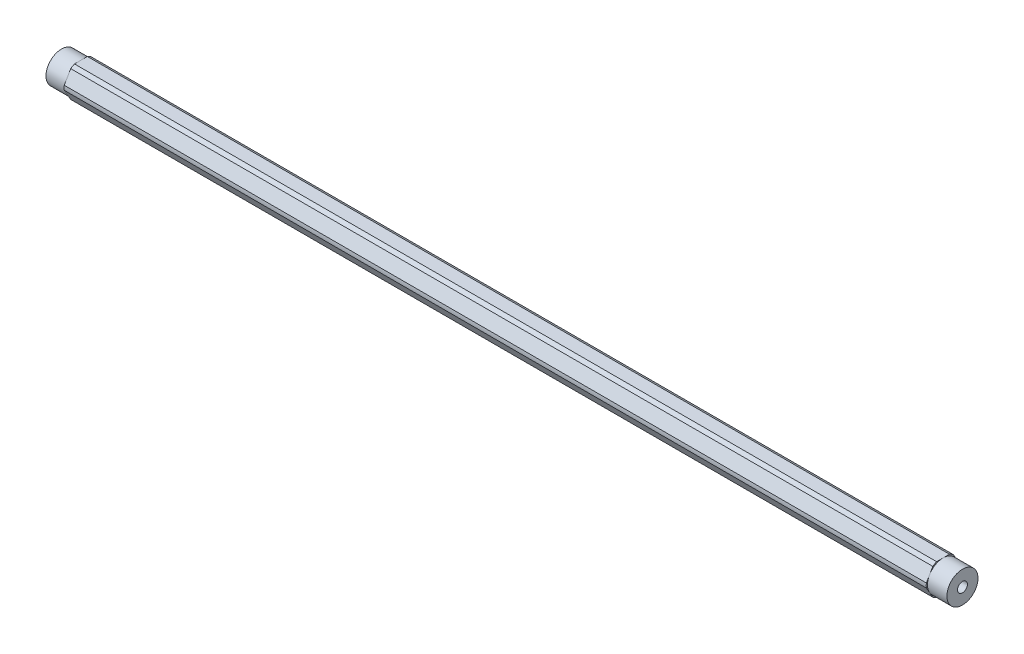
ISO-10303-21;
HEADER;
FILE_DESCRIPTION(('STEP AP214'),'2;1');
FILE_NAME('part.step','',(''),(''),'','','');
FILE_SCHEMA(('AUTOMOTIVE_DESIGN { 1 0 10303 214 1 1 1 1 }'));
ENDSEC;
DATA;
#1=APPLICATION_CONTEXT('core data for automotive mechanical design processes');
#2=APPLICATION_PROTOCOL_DEFINITION('international standard','automotive_design',2000,#1);
#3=PRODUCT_CONTEXT('',#1,'mechanical');
#4=PRODUCT('Part','Part','',(#3));
#5=PRODUCT_RELATED_PRODUCT_CATEGORY('part','',(#4));
#6=PRODUCT_DEFINITION_FORMATION('','',#4);
#7=PRODUCT_DEFINITION_CONTEXT('part definition',#1,'design');
#8=PRODUCT_DEFINITION('design','',#6,#7);
#9=PRODUCT_DEFINITION_SHAPE('','',#8);
#10=(LENGTH_UNIT() NAMED_UNIT(*) SI_UNIT(.MILLI.,.METRE.));
#11=(NAMED_UNIT(*) PLANE_ANGLE_UNIT() SI_UNIT($,.RADIAN.));
#12=(NAMED_UNIT(*) SI_UNIT($,.STERADIAN.) SOLID_ANGLE_UNIT());
#13=UNCERTAINTY_MEASURE_WITH_UNIT(LENGTH_MEASURE(1.E-05),#10,'distance_accuracy_value','');
#14=(GEOMETRIC_REPRESENTATION_CONTEXT(3) GLOBAL_UNCERTAINTY_ASSIGNED_CONTEXT((#13)) GLOBAL_UNIT_ASSIGNED_CONTEXT((#10,
#11,#12)) REPRESENTATION_CONTEXT('',''));
#15=CARTESIAN_POINT('',(0.,0.,0.));
#16=DIRECTION('',(0.,0.,1.));
#17=DIRECTION('',(1.,0.,0.));
#18=AXIS2_PLACEMENT_3D('',#15,#16,#17);
#19=CARTESIAN_POINT('',(-184.15,0.,0.));
#20=DIRECTION('',(1.,0.,0.));
#21=DIRECTION('',(0.,0.,-1.));
#22=AXIS2_PLACEMENT_3D('',#19,#20,#21);
#23=PLANE('',#22);
#24=CARTESIAN_POINT('',(-184.15,0.,0.));
#25=DIRECTION('',(1.,0.,0.));
#26=DIRECTION('',(0.,0.,-1.));
#27=AXIS2_PLACEMENT_3D('',#24,#25,#26);
#28=CIRCLE('',#27,2.0193);
#29=CARTESIAN_POINT('',(-184.15,0.,-2.0193));
#30=VERTEX_POINT('',#29);
#31=EDGE_CURVE('E255',#30,#30,#28,.T.);
#32=ORIENTED_EDGE('',*,*,#31,.T.);
#33=EDGE_LOOP('',(#32));
#34=FACE_BOUND('',#33,.T.);
#35=CARTESIAN_POINT('',(-184.15,0.,0.));
#36=DIRECTION('',(1.,0.,0.));
#37=DIRECTION('',(0.,0.,-1.));
#38=AXIS2_PLACEMENT_3D('',#35,#36,#37);
#39=CIRCLE('',#38,6.35);
#40=CARTESIAN_POINT('',(-184.15,0.,-6.35));
#41=VERTEX_POINT('',#40);
#42=EDGE_CURVE('E65',#41,#41,#39,.F.);
#43=ORIENTED_EDGE('',*,*,#42,.T.);
#44=EDGE_LOOP('',(#43));
#45=FACE_BOUND('',#44,.T.);
#46=ADVANCED_FACE('F57',(#34,#45),#23,.F.);
#47=CARTESIAN_POINT('',(184.15,3.175,-5.49926131403119));
#48=DIRECTION('',(0.,-0.5,0.866025403784438));
#49=DIRECTION('',(0.,-0.866025403784439,-0.5));
#50=AXIS2_PLACEMENT_3D('',#47,#48,#49);
#51=PLANE('',#50);
#52=DIRECTION('',(-1.,0.,0.));
#53=VECTOR('',#52,1.);
#54=CARTESIAN_POINT('',(184.15,0.893039571032185,-6.81675178197583));
#55=LINE('',#54,#53);
#56=CARTESIAN_POINT('',(176.2125,0.893039571032185,-6.81675178197583));
#57=VERTEX_POINT('',#56);
#58=CARTESIAN_POINT('',(-176.2125,0.893039571032185,-6.81675178197583));
#59=VERTEX_POINT('',#58);
#60=EDGE_CURVE('E214',#57,#59,#55,.T.);
#61=ORIENTED_EDGE('',*,*,#60,.T.);
#62=DIRECTION('',(0.,0.866025403784439,0.5));
#63=VECTOR('',#62,1.);
#64=CARTESIAN_POINT('',(-176.2125,3.175,-5.49926131403119));
#65=LINE('',#64,#63);
#66=CARTESIAN_POINT('',(-176.2125,3.175,-5.49926131403119));
#67=VERTEX_POINT('',#66);
#68=EDGE_CURVE('E72',#59,#67,#65,.T.);
#69=ORIENTED_EDGE('',*,*,#68,.T.);
#70=CARTESIAN_POINT('',(-176.2125,5.45696042896782,-4.18177084608654));
#71=VERTEX_POINT('',#70);
#72=EDGE_CURVE('E183',#67,#71,#65,.T.);
#73=ORIENTED_EDGE('',*,*,#72,.T.);
#74=DIRECTION('',(-1.,0.,0.));
#75=VECTOR('',#74,1.);
#76=CARTESIAN_POINT('',(184.15,5.45696042896782,-4.18177084608654));
#77=LINE('',#76,#75);
#78=CARTESIAN_POINT('',(176.2125,5.45696042896782,-4.18177084608654));
#79=VERTEX_POINT('',#78);
#80=EDGE_CURVE('E289',#79,#71,#77,.T.);
#81=ORIENTED_EDGE('',*,*,#80,.F.);
#82=DIRECTION('',(0.,0.866025403784439,0.5));
#83=VECTOR('',#82,1.);
#84=CARTESIAN_POINT('',(176.2125,3.175,-5.49926131403119));
#85=LINE('',#84,#83);
#86=CARTESIAN_POINT('',(176.2125,3.175,-5.49926131403119));
#87=VERTEX_POINT('',#86);
#88=EDGE_CURVE('E249',#87,#79,#85,.T.);
#89=ORIENTED_EDGE('',*,*,#88,.F.);
#90=EDGE_CURVE('E251',#57,#87,#85,.T.);
#91=ORIENTED_EDGE('',*,*,#90,.F.);
#92=EDGE_LOOP('',(#61,#69,#73,#81,#89,#91));
#93=FACE_BOUND('',#92,.T.);
#94=ADVANCED_FACE('F211',(#93),#51,.F.);
#95=CARTESIAN_POINT('',(184.15,0.,0.));
#96=DIRECTION('',(-1.,0.,0.));
#97=DIRECTION('',(0.,0.,1.));
#98=AXIS2_PLACEMENT_3D('',#95,#96,#97);
#99=CYLINDRICAL_SURFACE('',#98,6.874999966);
#100=ORIENTED_EDGE('',*,*,#80,.T.);
#101=CARTESIAN_POINT('',(-176.2125,0.,0.));
#102=DIRECTION('',(1.,0.,0.));
#103=DIRECTION('',(0.,0.,-1.));
#104=AXIS2_PLACEMENT_3D('',#101,#102,#103);
#105=CIRCLE('',#104,6.874999966);
#106=CARTESIAN_POINT('',(-176.2125,6.35,-2.63498093588929));
#107=VERTEX_POINT('',#106);
#108=EDGE_CURVE('E189',#71,#107,#105,.T.);
#109=ORIENTED_EDGE('',*,*,#108,.T.);
#110=DIRECTION('',(-1.,0.,0.));
#111=VECTOR('',#110,1.);
#112=CARTESIAN_POINT('',(184.15,6.35,-2.63498093588929));
#113=LINE('',#112,#111);
#114=CARTESIAN_POINT('',(176.2125,6.35,-2.63498093588929));
#115=VERTEX_POINT('',#114);
#116=EDGE_CURVE('E286',#115,#107,#113,.T.);
#117=ORIENTED_EDGE('',*,*,#116,.F.);
#118=CARTESIAN_POINT('',(176.2125,0.,0.));
#119=DIRECTION('',(1.,0.,0.));
#120=DIRECTION('',(0.,0.,-1.));
#121=AXIS2_PLACEMENT_3D('',#118,#119,#120);
#122=CIRCLE('',#121,6.874999966);
#123=EDGE_CURVE('E247',#79,#115,#122,.T.);
#124=ORIENTED_EDGE('',*,*,#123,.F.);
#125=EDGE_LOOP('',(#100,#109,#117,#124));
#126=FACE_BOUND('',#125,.T.);
#127=ADVANCED_FACE('F314',(#126),#99,.T.);
#128=CARTESIAN_POINT('',(184.15,6.35,0.));
#129=DIRECTION('',(0.,-1.,0.));
#130=DIRECTION('',(0.,0.,-1.));
#131=AXIS2_PLACEMENT_3D('',#128,#129,#130);
#132=PLANE('',#131);
#133=ORIENTED_EDGE('',*,*,#116,.T.);
#134=DIRECTION('',(0.,0.,1.));
#135=VECTOR('',#134,1.);
#136=CARTESIAN_POINT('',(-176.2125,6.35,0.));
#137=LINE('',#136,#135);
#138=CARTESIAN_POINT('',(-176.2125,6.35,0.));
#139=VERTEX_POINT('',#138);
#140=EDGE_CURVE('E353',#107,#139,#137,.T.);
#141=ORIENTED_EDGE('',*,*,#140,.T.);
#142=CARTESIAN_POINT('',(-176.2125,6.35,2.63498093588929));
#143=VERTEX_POINT('',#142);
#144=EDGE_CURVE('E356',#139,#143,#137,.T.);
#145=ORIENTED_EDGE('',*,*,#144,.T.);
#146=DIRECTION('',(-1.,0.,0.));
#147=VECTOR('',#146,1.);
#148=CARTESIAN_POINT('',(184.15,6.35,2.63498093588929));
#149=LINE('',#148,#147);
#150=CARTESIAN_POINT('',(176.2125,6.35,2.63498093588929));
#151=VERTEX_POINT('',#150);
#152=EDGE_CURVE('E283',#151,#143,#149,.T.);
#153=ORIENTED_EDGE('',*,*,#152,.F.);
#154=DIRECTION('',(0.,0.,1.));
#155=VECTOR('',#154,1.);
#156=CARTESIAN_POINT('',(176.2125,6.35,0.));
#157=LINE('',#156,#155);
#158=CARTESIAN_POINT('',(176.2125,6.35,0.));
#159=VERTEX_POINT('',#158);
#160=EDGE_CURVE('E244',#159,#151,#157,.T.);
#161=ORIENTED_EDGE('',*,*,#160,.F.);
#162=EDGE_CURVE('E246',#115,#159,#157,.T.);
#163=ORIENTED_EDGE('',*,*,#162,.F.);
#164=EDGE_LOOP('',(#133,#141,#145,#153,#161,#163));
#165=FACE_BOUND('',#164,.T.);
#166=ADVANCED_FACE('F321',(#165),#132,.F.);
#167=ORIENTED_EDGE('',*,*,#152,.T.);
#168=CARTESIAN_POINT('',(-176.2125,0.,0.));
#169=DIRECTION('',(1.,0.,0.));
#170=DIRECTION('',(0.,0.,-1.));
#171=AXIS2_PLACEMENT_3D('',#168,#169,#170);
#172=CIRCLE('',#171,6.874999966);
#173=CARTESIAN_POINT('',(-176.2125,5.45696042896782,4.18177084608655));
#174=VERTEX_POINT('',#173);
#175=EDGE_CURVE('E357',#143,#174,#172,.T.);
#176=ORIENTED_EDGE('',*,*,#175,.T.);
#177=DIRECTION('',(-1.,0.,0.));
#178=VECTOR('',#177,1.);
#179=CARTESIAN_POINT('',(184.15,5.45696042896782,4.18177084608655));
#180=LINE('',#179,#178);
#181=CARTESIAN_POINT('',(176.2125,5.45696042896782,4.18177084608655));
#182=VERTEX_POINT('',#181);
#183=EDGE_CURVE('E280',#182,#174,#180,.T.);
#184=ORIENTED_EDGE('',*,*,#183,.F.);
#185=CARTESIAN_POINT('',(176.2125,0.,0.));
#186=DIRECTION('',(1.,0.,0.));
#187=DIRECTION('',(0.,0.,-1.));
#188=AXIS2_PLACEMENT_3D('',#185,#186,#187);
#189=CIRCLE('',#188,6.874999966);
#190=EDGE_CURVE('E242',#151,#182,#189,.T.);
#191=ORIENTED_EDGE('',*,*,#190,.F.);
#192=EDGE_LOOP('',(#167,#176,#184,#191));
#193=FACE_BOUND('',#192,.T.);
#194=ADVANCED_FACE('F323',(#193),#99,.T.);
#195=CARTESIAN_POINT('',(184.15,3.175,5.49926131403119));
#196=DIRECTION('',(0.,-0.5,-0.866025403784439));
#197=DIRECTION('',(0.,0.866025403784439,-0.5));
#198=AXIS2_PLACEMENT_3D('',#195,#196,#197);
#199=PLANE('',#198);
#200=ORIENTED_EDGE('',*,*,#183,.T.);
#201=DIRECTION('',(0.,-0.866025403784439,0.5));
#202=VECTOR('',#201,1.);
#203=CARTESIAN_POINT('',(-176.2125,3.175,5.49926131403119));
#204=LINE('',#203,#202);
#205=CARTESIAN_POINT('',(-176.2125,3.175,5.49926131403119));
#206=VERTEX_POINT('',#205);
#207=EDGE_CURVE('E361',#174,#206,#204,.T.);
#208=ORIENTED_EDGE('',*,*,#207,.T.);
#209=CARTESIAN_POINT('',(-176.2125,0.893039571032186,6.81675178197583));
#210=VERTEX_POINT('',#209);
#211=EDGE_CURVE('E362',#206,#210,#204,.T.);
#212=ORIENTED_EDGE('',*,*,#211,.T.);
#213=DIRECTION('',(-1.,0.,0.));
#214=VECTOR('',#213,1.);
#215=CARTESIAN_POINT('',(184.15,0.893039571032186,6.81675178197583));
#216=LINE('',#215,#214);
#217=CARTESIAN_POINT('',(176.2125,0.893039571032186,6.81675178197583));
#218=VERTEX_POINT('',#217);
#219=EDGE_CURVE('E277',#218,#210,#216,.T.);
#220=ORIENTED_EDGE('',*,*,#219,.F.);
#221=DIRECTION('',(0.,-0.866025403784439,0.5));
#222=VECTOR('',#221,1.);
#223=CARTESIAN_POINT('',(176.2125,3.175,5.49926131403119));
#224=LINE('',#223,#222);
#225=CARTESIAN_POINT('',(176.2125,3.175,5.49926131403119));
#226=VERTEX_POINT('',#225);
#227=EDGE_CURVE('E239',#226,#218,#224,.T.);
#228=ORIENTED_EDGE('',*,*,#227,.F.);
#229=EDGE_CURVE('E241',#182,#226,#224,.T.);
#230=ORIENTED_EDGE('',*,*,#229,.F.);
#231=EDGE_LOOP('',(#200,#208,#212,#220,#228,#230));
#232=FACE_BOUND('',#231,.T.);
#233=ADVANCED_FACE('F340',(#232),#199,.F.);
#234=ORIENTED_EDGE('',*,*,#219,.T.);
#235=CARTESIAN_POINT('',(-176.2125,0.,0.));
#236=DIRECTION('',(1.,0.,0.));
#237=DIRECTION('',(0.,0.,-1.));
#238=AXIS2_PLACEMENT_3D('',#235,#236,#237);
#239=CIRCLE('',#238,6.874999966);
#240=CARTESIAN_POINT('',(-176.2125,-0.893039571032186,6.81675178197583));
#241=VERTEX_POINT('',#240);
#242=EDGE_CURVE('E365',#210,#241,#239,.T.);
#243=ORIENTED_EDGE('',*,*,#242,.T.);
#244=DIRECTION('',(-1.,0.,0.));
#245=VECTOR('',#244,1.);
#246=CARTESIAN_POINT('',(184.15,-0.893039571032186,6.81675178197583));
#247=LINE('',#246,#245);
#248=CARTESIAN_POINT('',(176.2125,-0.893039571032186,6.81675178197583));
#249=VERTEX_POINT('',#248);
#250=EDGE_CURVE('E274',#249,#241,#247,.T.);
#251=ORIENTED_EDGE('',*,*,#250,.F.);
#252=CARTESIAN_POINT('',(176.2125,0.,0.));
#253=DIRECTION('',(1.,0.,0.));
#254=DIRECTION('',(0.,0.,-1.));
#255=AXIS2_PLACEMENT_3D('',#252,#253,#254);
#256=CIRCLE('',#255,6.874999966);
#257=EDGE_CURVE('E237',#218,#249,#256,.T.);
#258=ORIENTED_EDGE('',*,*,#257,.F.);
#259=EDGE_LOOP('',(#234,#243,#251,#258));
#260=FACE_BOUND('',#259,.T.);
#261=ADVANCED_FACE('F338',(#260),#99,.T.);
#262=CARTESIAN_POINT('',(184.15,-3.175,5.49926131403119));
#263=DIRECTION('',(0.,0.5,-0.866025403784439));
#264=DIRECTION('',(0.,0.866025403784439,0.5));
#265=AXIS2_PLACEMENT_3D('',#262,#263,#264);
#266=PLANE('',#265);
#267=ORIENTED_EDGE('',*,*,#250,.T.);
#268=DIRECTION('',(0.,-0.866025403784439,-0.5));
#269=VECTOR('',#268,1.);
#270=CARTESIAN_POINT('',(-176.2125,-3.175,5.49926131403119));
#271=LINE('',#270,#269);
#272=CARTESIAN_POINT('',(-176.2125,-3.175,5.49926131403119));
#273=VERTEX_POINT('',#272);
#274=EDGE_CURVE('E368',#241,#273,#271,.T.);
#275=ORIENTED_EDGE('',*,*,#274,.T.);
#276=CARTESIAN_POINT('',(-176.2125,-5.45696042896782,4.18177084608654));
#277=VERTEX_POINT('',#276);
#278=EDGE_CURVE('E369',#273,#277,#271,.T.);
#279=ORIENTED_EDGE('',*,*,#278,.T.);
#280=DIRECTION('',(-1.,0.,0.));
#281=VECTOR('',#280,1.);
#282=CARTESIAN_POINT('',(184.15,-5.45696042896782,4.18177084608655));
#283=LINE('',#282,#281);
#284=CARTESIAN_POINT('',(176.2125,-5.45696042896782,4.18177084608654));
#285=VERTEX_POINT('',#284);
#286=EDGE_CURVE('E271',#285,#277,#283,.T.);
#287=ORIENTED_EDGE('',*,*,#286,.F.);
#288=DIRECTION('',(0.,-0.866025403784439,-0.5));
#289=VECTOR('',#288,1.);
#290=CARTESIAN_POINT('',(176.2125,-3.175,5.49926131403119));
#291=LINE('',#290,#289);
#292=CARTESIAN_POINT('',(176.2125,-3.175,5.49926131403119));
#293=VERTEX_POINT('',#292);
#294=EDGE_CURVE('E234',#293,#285,#291,.T.);
#295=ORIENTED_EDGE('',*,*,#294,.F.);
#296=EDGE_CURVE('E236',#249,#293,#291,.T.);
#297=ORIENTED_EDGE('',*,*,#296,.F.);
#298=EDGE_LOOP('',(#267,#275,#279,#287,#295,#297));
#299=FACE_BOUND('',#298,.T.);
#300=ADVANCED_FACE('F335',(#299),#266,.F.);
#301=ORIENTED_EDGE('',*,*,#286,.T.);
#302=CARTESIAN_POINT('',(-176.2125,0.,0.));
#303=DIRECTION('',(1.,0.,0.));
#304=DIRECTION('',(0.,0.,-1.));
#305=AXIS2_PLACEMENT_3D('',#302,#303,#304);
#306=CIRCLE('',#305,6.874999966);
#307=CARTESIAN_POINT('',(-176.2125,-6.35,2.63498093588928));
#308=VERTEX_POINT('',#307);
#309=EDGE_CURVE('E372',#277,#308,#306,.T.);
#310=ORIENTED_EDGE('',*,*,#309,.T.);
#311=DIRECTION('',(-1.,0.,0.));
#312=VECTOR('',#311,1.);
#313=CARTESIAN_POINT('',(184.15,-6.35,2.63498093588928));
#314=LINE('',#313,#312);
#315=CARTESIAN_POINT('',(176.2125,-6.35,2.63498093588928));
#316=VERTEX_POINT('',#315);
#317=EDGE_CURVE('E268',#316,#308,#314,.T.);
#318=ORIENTED_EDGE('',*,*,#317,.F.);
#319=CARTESIAN_POINT('',(176.2125,0.,0.));
#320=DIRECTION('',(1.,0.,0.));
#321=DIRECTION('',(0.,0.,-1.));
#322=AXIS2_PLACEMENT_3D('',#319,#320,#321);
#323=CIRCLE('',#322,6.874999966);
#324=EDGE_CURVE('E232',#285,#316,#323,.T.);
#325=ORIENTED_EDGE('',*,*,#324,.F.);
#326=EDGE_LOOP('',(#301,#310,#318,#325));
#327=FACE_BOUND('',#326,.T.);
#328=ADVANCED_FACE('F333',(#327),#99,.T.);
#329=CARTESIAN_POINT('',(184.15,-6.35,0.));
#330=DIRECTION('',(0.,1.,0.));
#331=DIRECTION('',(0.,0.,1.));
#332=AXIS2_PLACEMENT_3D('',#329,#330,#331);
#333=PLANE('',#332);
#334=ORIENTED_EDGE('',*,*,#317,.T.);
#335=DIRECTION('',(0.,0.,-1.));
#336=VECTOR('',#335,1.);
#337=CARTESIAN_POINT('',(-176.2125,-6.35,0.));
#338=LINE('',#337,#336);
#339=CARTESIAN_POINT('',(-176.2125,-6.35,0.));
#340=VERTEX_POINT('',#339);
#341=EDGE_CURVE('E375',#308,#340,#338,.T.);
#342=ORIENTED_EDGE('',*,*,#341,.T.);
#343=CARTESIAN_POINT('',(-176.2125,-6.35,-2.63498093588928));
#344=VERTEX_POINT('',#343);
#345=EDGE_CURVE('E376',#340,#344,#338,.T.);
#346=ORIENTED_EDGE('',*,*,#345,.T.);
#347=DIRECTION('',(-1.,0.,0.));
#348=VECTOR('',#347,1.);
#349=CARTESIAN_POINT('',(184.15,-6.35,-2.63498093588928));
#350=LINE('',#349,#348);
#351=CARTESIAN_POINT('',(176.2125,-6.35,-2.63498093588928));
#352=VERTEX_POINT('',#351);
#353=EDGE_CURVE('E265',#352,#344,#350,.T.);
#354=ORIENTED_EDGE('',*,*,#353,.F.);
#355=DIRECTION('',(0.,0.,-1.));
#356=VECTOR('',#355,1.);
#357=CARTESIAN_POINT('',(176.2125,-6.35,0.));
#358=LINE('',#357,#356);
#359=CARTESIAN_POINT('',(176.2125,-6.35,0.));
#360=VERTEX_POINT('',#359);
#361=EDGE_CURVE('E229',#360,#352,#358,.T.);
#362=ORIENTED_EDGE('',*,*,#361,.F.);
#363=EDGE_CURVE('E231',#316,#360,#358,.T.);
#364=ORIENTED_EDGE('',*,*,#363,.F.);
#365=EDGE_LOOP('',(#334,#342,#346,#354,#362,#364));
#366=FACE_BOUND('',#365,.T.);
#367=ADVANCED_FACE('F330',(#366),#333,.F.);
#368=ORIENTED_EDGE('',*,*,#353,.T.);
#369=CARTESIAN_POINT('',(-176.2125,0.,0.));
#370=DIRECTION('',(1.,0.,0.));
#371=DIRECTION('',(0.,0.,-1.));
#372=AXIS2_PLACEMENT_3D('',#369,#370,#371);
#373=CIRCLE('',#372,6.874999966);
#374=CARTESIAN_POINT('',(-176.2125,-5.45696042896782,-4.18177084608655));
#375=VERTEX_POINT('',#374);
#376=EDGE_CURVE('E379',#344,#375,#373,.T.);
#377=ORIENTED_EDGE('',*,*,#376,.T.);
#378=DIRECTION('',(-1.,0.,0.));
#379=VECTOR('',#378,1.);
#380=CARTESIAN_POINT('',(184.15,-5.45696042896782,-4.18177084608655));
#381=LINE('',#380,#379);
#382=CARTESIAN_POINT('',(176.2125,-5.45696042896782,-4.18177084608655));
#383=VERTEX_POINT('',#382);
#384=EDGE_CURVE('E262',#383,#375,#381,.T.);
#385=ORIENTED_EDGE('',*,*,#384,.F.);
#386=CARTESIAN_POINT('',(176.2125,0.,0.));
#387=DIRECTION('',(1.,0.,0.));
#388=DIRECTION('',(0.,0.,-1.));
#389=AXIS2_PLACEMENT_3D('',#386,#387,#388);
#390=CIRCLE('',#389,6.874999966);
#391=EDGE_CURVE('E227',#352,#383,#390,.T.);
#392=ORIENTED_EDGE('',*,*,#391,.F.);
#393=EDGE_LOOP('',(#368,#377,#385,#392));
#394=FACE_BOUND('',#393,.T.);
#395=ADVANCED_FACE('F328',(#394),#99,.T.);
#396=CARTESIAN_POINT('',(184.15,-3.175,-5.49926131403119));
#397=DIRECTION('',(0.,0.5,0.866025403784439));
#398=DIRECTION('',(0.,-0.866025403784439,0.5));
#399=AXIS2_PLACEMENT_3D('',#396,#397,#398);
#400=PLANE('',#399);
#401=ORIENTED_EDGE('',*,*,#384,.T.);
#402=DIRECTION('',(0.,0.866025403784439,-0.5));
#403=VECTOR('',#402,1.);
#404=CARTESIAN_POINT('',(-176.2125,-3.175,-5.49926131403119));
#405=LINE('',#404,#403);
#406=CARTESIAN_POINT('',(-176.2125,-3.175,-5.49926131403119));
#407=VERTEX_POINT('',#406);
#408=EDGE_CURVE('E382',#375,#407,#405,.T.);
#409=ORIENTED_EDGE('',*,*,#408,.T.);
#410=CARTESIAN_POINT('',(-176.2125,-0.893039571032186,-6.81675178197583));
#411=VERTEX_POINT('',#410);
#412=EDGE_CURVE('E198',#407,#411,#405,.T.);
#413=ORIENTED_EDGE('',*,*,#412,.T.);
#414=DIRECTION('',(-1.,0.,0.));
#415=VECTOR('',#414,1.);
#416=CARTESIAN_POINT('',(184.15,-0.893039571032186,-6.81675178197583));
#417=LINE('',#416,#415);
#418=CARTESIAN_POINT('',(176.2125,-0.893039571032186,-6.81675178197583));
#419=VERTEX_POINT('',#418);
#420=EDGE_CURVE('E259',#419,#411,#417,.T.);
#421=ORIENTED_EDGE('',*,*,#420,.F.);
#422=DIRECTION('',(0.,0.866025403784439,-0.5));
#423=VECTOR('',#422,1.);
#424=CARTESIAN_POINT('',(176.2125,-3.175,-5.49926131403119));
#425=LINE('',#424,#423);
#426=CARTESIAN_POINT('',(176.2125,-3.175,-5.49926131403119));
#427=VERTEX_POINT('',#426);
#428=EDGE_CURVE('E79',#427,#419,#425,.T.);
#429=ORIENTED_EDGE('',*,*,#428,.F.);
#430=EDGE_CURVE('E226',#383,#427,#425,.T.);
#431=ORIENTED_EDGE('',*,*,#430,.F.);
#432=EDGE_LOOP('',(#401,#409,#413,#421,#429,#431));
#433=FACE_BOUND('',#432,.T.);
#434=ADVANCED_FACE('F325',(#433),#400,.F.);
#435=ORIENTED_EDGE('',*,*,#420,.T.);
#436=CARTESIAN_POINT('',(-176.2125,0.,0.));
#437=DIRECTION('',(1.,0.,0.));
#438=DIRECTION('',(0.,0.,-1.));
#439=AXIS2_PLACEMENT_3D('',#436,#437,#438);
#440=CIRCLE('',#439,6.874999966);
#441=EDGE_CURVE('E12',#411,#59,#440,.T.);
#442=ORIENTED_EDGE('',*,*,#441,.T.);
#443=ORIENTED_EDGE('',*,*,#60,.F.);
#444=CARTESIAN_POINT('',(176.2125,0.,0.));
#445=DIRECTION('',(1.,0.,0.));
#446=DIRECTION('',(0.,0.,-1.));
#447=AXIS2_PLACEMENT_3D('',#444,#445,#446);
#448=CIRCLE('',#447,6.874999966);
#449=EDGE_CURVE('E294',#419,#57,#448,.T.);
#450=ORIENTED_EDGE('',*,*,#449,.F.);
#451=EDGE_LOOP('',(#435,#442,#443,#450));
#452=FACE_BOUND('',#451,.T.);
#453=ADVANCED_FACE('F324',(#452),#99,.T.);
#454=CARTESIAN_POINT('',(184.15,0.,0.));
#455=DIRECTION('',(1.,0.,0.));
#456=DIRECTION('',(0.,0.,-1.));
#457=AXIS2_PLACEMENT_3D('',#454,#455,#456);
#458=PLANE('',#457);
#459=CARTESIAN_POINT('',(184.15,0.,0.));
#460=DIRECTION('',(1.,0.,0.));
#461=DIRECTION('',(0.,0.,-1.));
#462=AXIS2_PLACEMENT_3D('',#459,#460,#461);
#463=CIRCLE('',#462,2.0193);
#464=CARTESIAN_POINT('',(184.15,0.,-2.0193));
#465=VERTEX_POINT('',#464);
#466=EDGE_CURVE('E252',#465,#465,#463,.T.);
#467=ORIENTED_EDGE('',*,*,#466,.F.);
#468=EDGE_LOOP('',(#467));
#469=FACE_BOUND('',#468,.T.);
#470=CARTESIAN_POINT('',(184.15,0.,0.));
#471=DIRECTION('',(1.,0.,0.));
#472=DIRECTION('',(0.,0.,-1.));
#473=AXIS2_PLACEMENT_3D('',#470,#471,#472);
#474=CIRCLE('',#473,6.35);
#475=CARTESIAN_POINT('',(184.15,0.,-6.35));
#476=VERTEX_POINT('',#475);
#477=EDGE_CURVE('E291',#476,#476,#474,.T.);
#478=ORIENTED_EDGE('',*,*,#477,.T.);
#479=EDGE_LOOP('',(#478));
#480=FACE_BOUND('',#479,.T.);
#481=ADVANCED_FACE('F317',(#469,#480),#458,.T.);
#482=CARTESIAN_POINT('',(184.15,0.,0.));
#483=DIRECTION('',(-1.,0.,0.));
#484=DIRECTION('',(0.,0.,1.));
#485=AXIS2_PLACEMENT_3D('',#482,#483,#484);
#486=CYLINDRICAL_SURFACE('',#485,2.0193);
#487=ORIENTED_EDGE('',*,*,#466,.T.);
#488=EDGE_LOOP('',(#487));
#489=FACE_BOUND('',#488,.T.);
#490=ORIENTED_EDGE('',*,*,#31,.F.);
#491=EDGE_LOOP('',(#490));
#492=FACE_BOUND('',#491,.T.);
#493=ADVANCED_FACE('F59',(#489,#492),#486,.F.);
#494=CARTESIAN_POINT('',(176.2125,0.,0.));
#495=DIRECTION('',(1.,0.,0.));
#496=DIRECTION('',(0.,0.,-1.));
#497=AXIS2_PLACEMENT_3D('',#494,#495,#496);
#498=PLANE('',#497);
#499=ORIENTED_EDGE('',*,*,#90,.T.);
#500=CARTESIAN_POINT('',(176.2125,0.,0.));
#501=DIRECTION('',(1.,0.,0.));
#502=DIRECTION('',(0.,0.,-1.));
#503=AXIS2_PLACEMENT_3D('',#500,#501,#502);
#504=CIRCLE('',#503,6.35);
#505=EDGE_CURVE('E215',#427,#87,#504,.T.);
#506=ORIENTED_EDGE('',*,*,#505,.F.);
#507=ORIENTED_EDGE('',*,*,#428,.T.);
#508=ORIENTED_EDGE('',*,*,#449,.T.);
#509=EDGE_LOOP('',(#499,#506,#507,#508));
#510=FACE_BOUND('',#509,.T.);
#511=ADVANCED_FACE('F429',(#510),#498,.T.);
#512=ORIENTED_EDGE('',*,*,#88,.T.);
#513=ORIENTED_EDGE('',*,*,#123,.T.);
#514=ORIENTED_EDGE('',*,*,#162,.T.);
#515=EDGE_CURVE('E219',#87,#159,#504,.T.);
#516=ORIENTED_EDGE('',*,*,#515,.F.);
#517=EDGE_LOOP('',(#512,#513,#514,#516));
#518=FACE_BOUND('',#517,.T.);
#519=ADVANCED_FACE('F423',(#518),#498,.T.);
#520=ORIENTED_EDGE('',*,*,#160,.T.);
#521=ORIENTED_EDGE('',*,*,#190,.T.);
#522=ORIENTED_EDGE('',*,*,#229,.T.);
#523=EDGE_CURVE('E224',#159,#226,#504,.T.);
#524=ORIENTED_EDGE('',*,*,#523,.F.);
#525=EDGE_LOOP('',(#520,#521,#522,#524));
#526=FACE_BOUND('',#525,.T.);
#527=ADVANCED_FACE('F412',(#526),#498,.T.);
#528=ORIENTED_EDGE('',*,*,#227,.T.);
#529=ORIENTED_EDGE('',*,*,#257,.T.);
#530=ORIENTED_EDGE('',*,*,#296,.T.);
#531=EDGE_CURVE('E417',#226,#293,#504,.T.);
#532=ORIENTED_EDGE('',*,*,#531,.F.);
#533=EDGE_LOOP('',(#528,#529,#530,#532));
#534=FACE_BOUND('',#533,.T.);
#535=ADVANCED_FACE('F445',(#534),#498,.T.);
#536=ORIENTED_EDGE('',*,*,#294,.T.);
#537=ORIENTED_EDGE('',*,*,#324,.T.);
#538=ORIENTED_EDGE('',*,*,#363,.T.);
#539=EDGE_CURVE('E431',#293,#360,#504,.T.);
#540=ORIENTED_EDGE('',*,*,#539,.F.);
#541=EDGE_LOOP('',(#536,#537,#538,#540));
#542=FACE_BOUND('',#541,.T.);
#543=ADVANCED_FACE('F439',(#542),#498,.T.);
#544=ORIENTED_EDGE('',*,*,#361,.T.);
#545=ORIENTED_EDGE('',*,*,#391,.T.);
#546=ORIENTED_EDGE('',*,*,#430,.T.);
#547=EDGE_CURVE('E217',#360,#427,#504,.T.);
#548=ORIENTED_EDGE('',*,*,#547,.F.);
#549=EDGE_LOOP('',(#544,#545,#546,#548));
#550=FACE_BOUND('',#549,.T.);
#551=ADVANCED_FACE('F427',(#550),#498,.T.);
#552=CARTESIAN_POINT('',(176.2125,0.,0.));
#553=DIRECTION('',(1.,0.,0.));
#554=DIRECTION('',(0.,0.,-1.));
#555=AXIS2_PLACEMENT_3D('',#552,#553,#554);
#556=CYLINDRICAL_SURFACE('',#555,6.35);
#557=ORIENTED_EDGE('',*,*,#477,.F.);
#558=EDGE_LOOP('',(#557));
#559=FACE_BOUND('',#558,.T.);
#560=ORIENTED_EDGE('',*,*,#505,.T.);
#561=ORIENTED_EDGE('',*,*,#515,.T.);
#562=ORIENTED_EDGE('',*,*,#523,.T.);
#563=ORIENTED_EDGE('',*,*,#531,.T.);
#564=ORIENTED_EDGE('',*,*,#539,.T.);
#565=ORIENTED_EDGE('',*,*,#547,.T.);
#566=EDGE_LOOP('',(#560,#561,#562,#563,#564,#565));
#567=FACE_BOUND('',#566,.T.);
#568=ADVANCED_FACE('F419',(#559,#567),#556,.T.);
#569=CARTESIAN_POINT('',(-176.2125,0.,0.));
#570=DIRECTION('',(1.,0.,0.));
#571=DIRECTION('',(0.,0.,-1.));
#572=AXIS2_PLACEMENT_3D('',#569,#570,#571);
#573=PLANE('',#572);
#574=ORIENTED_EDGE('',*,*,#441,.F.);
#575=ORIENTED_EDGE('',*,*,#412,.F.);
#576=CARTESIAN_POINT('',(-176.2125,0.,0.));
#577=DIRECTION('',(1.,0.,0.));
#578=DIRECTION('',(0.,0.,-1.));
#579=AXIS2_PLACEMENT_3D('',#576,#577,#578);
#580=CIRCLE('',#579,6.35);
#581=EDGE_CURVE('E195',#407,#67,#580,.T.);
#582=ORIENTED_EDGE('',*,*,#581,.T.);
#583=ORIENTED_EDGE('',*,*,#68,.F.);
#584=EDGE_LOOP('',(#574,#575,#582,#583));
#585=FACE_BOUND('',#584,.T.);
#586=ADVANCED_FACE('F196',(#585),#573,.F.);
#587=EDGE_CURVE('E186',#67,#139,#580,.T.);
#588=ORIENTED_EDGE('',*,*,#587,.T.);
#589=ORIENTED_EDGE('',*,*,#140,.F.);
#590=ORIENTED_EDGE('',*,*,#108,.F.);
#591=ORIENTED_EDGE('',*,*,#72,.F.);
#592=EDGE_LOOP('',(#588,#589,#590,#591));
#593=FACE_BOUND('',#592,.T.);
#594=ADVANCED_FACE('F184',(#593),#573,.F.);
#595=EDGE_CURVE('E209',#139,#206,#580,.T.);
#596=ORIENTED_EDGE('',*,*,#595,.T.);
#597=ORIENTED_EDGE('',*,*,#207,.F.);
#598=ORIENTED_EDGE('',*,*,#175,.F.);
#599=ORIENTED_EDGE('',*,*,#144,.F.);
#600=EDGE_LOOP('',(#596,#597,#598,#599));
#601=FACE_BOUND('',#600,.T.);
#602=ADVANCED_FACE('F403',(#601),#573,.F.);
#603=EDGE_CURVE('E398',#206,#273,#580,.T.);
#604=ORIENTED_EDGE('',*,*,#603,.T.);
#605=ORIENTED_EDGE('',*,*,#274,.F.);
#606=ORIENTED_EDGE('',*,*,#242,.F.);
#607=ORIENTED_EDGE('',*,*,#211,.F.);
#608=EDGE_LOOP('',(#604,#605,#606,#607));
#609=FACE_BOUND('',#608,.T.);
#610=ADVANCED_FACE('F442',(#609),#573,.F.);
#611=EDGE_CURVE('E395',#273,#340,#580,.T.);
#612=ORIENTED_EDGE('',*,*,#611,.T.);
#613=ORIENTED_EDGE('',*,*,#341,.F.);
#614=ORIENTED_EDGE('',*,*,#309,.F.);
#615=ORIENTED_EDGE('',*,*,#278,.F.);
#616=EDGE_LOOP('',(#612,#613,#614,#615));
#617=FACE_BOUND('',#616,.T.);
#618=ADVANCED_FACE('F304',(#617),#573,.F.);
#619=EDGE_CURVE('E202',#340,#407,#580,.T.);
#620=ORIENTED_EDGE('',*,*,#619,.T.);
#621=ORIENTED_EDGE('',*,*,#408,.F.);
#622=ORIENTED_EDGE('',*,*,#376,.F.);
#623=ORIENTED_EDGE('',*,*,#345,.F.);
#624=EDGE_LOOP('',(#620,#621,#622,#623));
#625=FACE_BOUND('',#624,.T.);
#626=ADVANCED_FACE('F299',(#625),#573,.F.);
#627=CARTESIAN_POINT('',(-176.2125,0.,0.));
#628=DIRECTION('',(-1.,0.,0.));
#629=DIRECTION('',(0.,0.,1.));
#630=AXIS2_PLACEMENT_3D('',#627,#628,#629);
#631=CYLINDRICAL_SURFACE('',#630,6.35);
#632=ORIENTED_EDGE('',*,*,#587,.F.);
#633=ORIENTED_EDGE('',*,*,#581,.F.);
#634=ORIENTED_EDGE('',*,*,#619,.F.);
#635=ORIENTED_EDGE('',*,*,#611,.F.);
#636=ORIENTED_EDGE('',*,*,#603,.F.);
#637=ORIENTED_EDGE('',*,*,#595,.F.);
#638=EDGE_LOOP('',(#632,#633,#634,#635,#636,#637));
#639=FACE_BOUND('',#638,.T.);
#640=ORIENTED_EDGE('',*,*,#42,.F.);
#641=EDGE_LOOP('',(#640));
#642=FACE_BOUND('',#641,.T.);
#643=ADVANCED_FACE('F205',(#639,#642),#631,.T.);
#644=CLOSED_SHELL('',(#46,#94,#127,#166,#194,#233,#261,#300,#328,#367,#395,#434,#453,#481,#493,
#511,#519,#527,#535,#543,#551,#568,#586,#594,#602,#610,#618,#626,#643));
#645=MANIFOLD_SOLID_BREP('B2',#644);
#646=ADVANCED_BREP_SHAPE_REPRESENTATION('',(#18,#645),#14);
#647=SHAPE_DEFINITION_REPRESENTATION(#9,#646);
ENDSEC;
END-ISO-10303-21;
